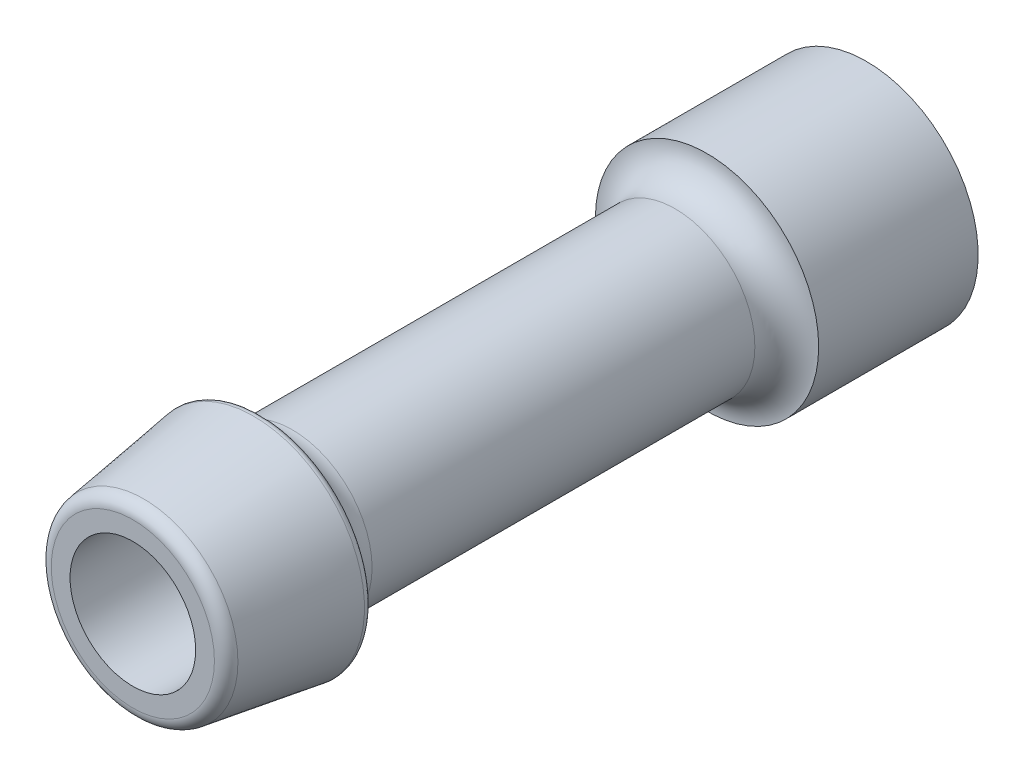
ISO-10303-21;
HEADER;
FILE_DESCRIPTION(('STEP AP214'),'2;1');
FILE_NAME('part.step','',(''),(''),'','','');
FILE_SCHEMA(('AUTOMOTIVE_DESIGN { 1 0 10303 214 1 1 1 1 }'));
ENDSEC;
DATA;
#1=APPLICATION_CONTEXT('core data for automotive mechanical design processes');
#2=APPLICATION_PROTOCOL_DEFINITION('international standard','automotive_design',2000,#1);
#3=PRODUCT_CONTEXT('',#1,'mechanical');
#4=PRODUCT('Part','Part','',(#3));
#5=PRODUCT_RELATED_PRODUCT_CATEGORY('part','',(#4));
#6=PRODUCT_DEFINITION_FORMATION('','',#4);
#7=PRODUCT_DEFINITION_CONTEXT('part definition',#1,'design');
#8=PRODUCT_DEFINITION('design','',#6,#7);
#9=PRODUCT_DEFINITION_SHAPE('','',#8);
#10=(LENGTH_UNIT() NAMED_UNIT(*) SI_UNIT(.MILLI.,.METRE.));
#11=(NAMED_UNIT(*) PLANE_ANGLE_UNIT() SI_UNIT($,.RADIAN.));
#12=(NAMED_UNIT(*) SI_UNIT($,.STERADIAN.) SOLID_ANGLE_UNIT());
#13=UNCERTAINTY_MEASURE_WITH_UNIT(LENGTH_MEASURE(1.E-05),#10,'distance_accuracy_value','');
#14=(GEOMETRIC_REPRESENTATION_CONTEXT(3) GLOBAL_UNCERTAINTY_ASSIGNED_CONTEXT((#13)) GLOBAL_UNIT_ASSIGNED_CONTEXT((#10,
#11,#12)) REPRESENTATION_CONTEXT('',''));
#15=CARTESIAN_POINT('',(0.,0.,0.));
#16=DIRECTION('',(0.,0.,1.));
#17=DIRECTION('',(1.,0.,0.));
#18=AXIS2_PLACEMENT_3D('',#15,#16,#17);
#19=CARTESIAN_POINT('',(0.,0.,29.21));
#20=DIRECTION('',(0.,0.,-1.));
#21=DIRECTION('',(-1.,0.,0.));
#22=AXIS2_PLACEMENT_3D('',#19,#20,#21);
#23=CYLINDRICAL_SURFACE('',#22,4.445);
#24=CARTESIAN_POINT('',(0.,0.,0.));
#25=DIRECTION('',(0.,0.,1.));
#26=DIRECTION('',(1.,0.,0.));
#27=AXIS2_PLACEMENT_3D('',#24,#25,#26);
#28=CIRCLE('',#27,4.445);
#29=CARTESIAN_POINT('',(-4.445,0.,0.));
#30=VERTEX_POINT('',#29);
#31=EDGE_CURVE('E71',#30,#30,#28,.T.);
#32=CARTESIAN_POINT('',(0.,0.,6.35));
#33=DIRECTION('',(0.,0.,1.));
#34=DIRECTION('',(1.,0.,0.));
#35=AXIS2_PLACEMENT_3D('',#32,#33,#34);
#36=CIRCLE('',#35,4.445);
#37=CARTESIAN_POINT('',(-4.445,0.,6.34999999999999));
#38=VERTEX_POINT('',#37);
#39=EDGE_CURVE('E72',#38,#38,#36,.T.);
#40=CARTESIAN_POINT('',(-4.445,0.,0.));
#41=CARTESIAN_POINT('',(-4.445,0.,0.066145833333333));
#42=CARTESIAN_POINT('',(-4.445,0.,0.132291666666666));
#43=CARTESIAN_POINT('',(-4.445,0.,0.264583333333332));
#44=CARTESIAN_POINT('',(-4.445,0.,0.330729166666665));
#45=CARTESIAN_POINT('',(-4.445,0.,0.463020833333332));
#46=CARTESIAN_POINT('',(-4.445,0.,0.529166666666666));
#47=CARTESIAN_POINT('',(-4.445,0.,0.661458333333333));
#48=CARTESIAN_POINT('',(-4.445,0.,0.727604166666666));
#49=CARTESIAN_POINT('',(-4.445,0.,0.859895833333332));
#50=CARTESIAN_POINT('',(-4.445,0.,0.926041666666665));
#51=CARTESIAN_POINT('',(-4.445,0.,1.05833333333333));
#52=CARTESIAN_POINT('',(-4.445,0.,1.12447916666667));
#53=CARTESIAN_POINT('',(-4.445,0.,1.25677083333333));
#54=CARTESIAN_POINT('',(-4.445,0.,1.32291666666667));
#55=CARTESIAN_POINT('',(-4.445,0.,1.45520833333333));
#56=CARTESIAN_POINT('',(-4.445,0.,1.52135416666667));
#57=CARTESIAN_POINT('',(-4.445,0.,1.65364583333333));
#58=CARTESIAN_POINT('',(-4.445,0.,1.71979166666666));
#59=CARTESIAN_POINT('',(-4.445,0.,1.85208333333333));
#60=CARTESIAN_POINT('',(-4.445,0.,1.91822916666666));
#61=CARTESIAN_POINT('',(-4.445,0.,2.05052083333333));
#62=CARTESIAN_POINT('',(-4.445,0.,2.11666666666666));
#63=CARTESIAN_POINT('',(-4.445,0.,2.24895833333333));
#64=CARTESIAN_POINT('',(-4.445,0.,2.31510416666667));
#65=CARTESIAN_POINT('',(-4.445,0.,2.44739583333333));
#66=CARTESIAN_POINT('',(-4.445,0.,2.51354166666666));
#67=CARTESIAN_POINT('',(-4.445,0.,2.64583333333333));
#68=CARTESIAN_POINT('',(-4.445,0.,2.71197916666667));
#69=CARTESIAN_POINT('',(-4.445,0.,2.84427083333333));
#70=CARTESIAN_POINT('',(-4.445,0.,2.91041666666667));
#71=CARTESIAN_POINT('',(-4.445,0.,3.04270833333333));
#72=CARTESIAN_POINT('',(-4.445,0.,3.10885416666666));
#73=CARTESIAN_POINT('',(-4.445,0.,3.24114583333333));
#74=CARTESIAN_POINT('',(-4.445,0.,3.30729166666666));
#75=CARTESIAN_POINT('',(-4.445,0.,3.43958333333333));
#76=CARTESIAN_POINT('',(-4.445,0.,3.50572916666666));
#77=CARTESIAN_POINT('',(-4.445,0.,3.63802083333333));
#78=CARTESIAN_POINT('',(-4.445,0.,3.70416666666666));
#79=CARTESIAN_POINT('',(-4.445,0.,3.83645833333333));
#80=CARTESIAN_POINT('',(-4.445,0.,3.90260416666666));
#81=CARTESIAN_POINT('',(-4.445,0.,4.03489583333333));
#82=CARTESIAN_POINT('',(-4.445,0.,4.10104166666666));
#83=CARTESIAN_POINT('',(-4.445,0.,4.23333333333333));
#84=CARTESIAN_POINT('',(-4.445,0.,4.29947916666666));
#85=CARTESIAN_POINT('',(-4.445,0.,4.43177083333333));
#86=CARTESIAN_POINT('',(-4.445,0.,4.49791666666666));
#87=CARTESIAN_POINT('',(-4.445,0.,4.63020833333333));
#88=CARTESIAN_POINT('',(-4.445,0.,4.69635416666666));
#89=CARTESIAN_POINT('',(-4.445,0.,4.82864583333333));
#90=CARTESIAN_POINT('',(-4.445,0.,4.89479166666666));
#91=CARTESIAN_POINT('',(-4.445,0.,5.02708333333333));
#92=CARTESIAN_POINT('',(-4.445,0.,5.09322916666666));
#93=CARTESIAN_POINT('',(-4.445,0.,5.22552083333333));
#94=CARTESIAN_POINT('',(-4.445,0.,5.29166666666666));
#95=CARTESIAN_POINT('',(-4.445,0.,5.42395833333333));
#96=CARTESIAN_POINT('',(-4.445,0.,5.49010416666666));
#97=CARTESIAN_POINT('',(-4.445,0.,5.62239583333333));
#98=CARTESIAN_POINT('',(-4.445,0.,5.68854166666666));
#99=CARTESIAN_POINT('',(-4.445,0.,5.82083333333333));
#100=CARTESIAN_POINT('',(-4.445,0.,5.88697916666666));
#101=CARTESIAN_POINT('',(-4.445,0.,6.01927083333333));
#102=CARTESIAN_POINT('',(-4.445,0.,6.08541666666666));
#103=CARTESIAN_POINT('',(-4.445,0.,6.21770833333333));
#104=CARTESIAN_POINT('',(-4.445,0.,6.28385416666666));
#105=CARTESIAN_POINT('',(-4.445,0.,6.34999999999999));
#106=B_SPLINE_CURVE_WITH_KNOTS('',3,(#40,#41,#42,#43,#44,#45,#46,#47,#48,#49,#50,#51,#52,#53,
#54,#55,#56,#57,#58,#59,#60,#61,#62,#63,#64,#65,#66,#67,#68,#69,#70,#71,#72,#73,#74,#75,#76,#77,
#78,#79,#80,#81,#82,#83,#84,#85,#86,#87,#88,#89,#90,#91,#92,#93,#94,#95,#96,#97,#98,#99,#100,
#101,#102,#103,#104,#105),.UNSPECIFIED.,.F.,.F.,(4,2,2,2,2,2,2,2,2,2,2,2,2,2,2,2,2,2,2,2,2,2,2,
2,2,2,2,2,2,2,2,2,4),(0.,0.198437499999999,0.396874999999998,0.5953125,0.793749999999999,
0.992187499999998,1.190625,1.3890625,1.5875,1.7859375,1.984375,2.1828125,2.38125,2.5796875,
2.778125,2.9765625,3.175,3.3734375,3.571875,3.7703125,3.96875,4.1671875,4.365625,4.5640625,
4.7625,4.96093749999999,5.15937499999999,5.3578125,5.55625,5.75468749999999,5.953125,6.1515625,
6.34999999999999),.UNSPECIFIED.);
#107=EDGE_CURVE('BSEAM39',#30,#38,#106,.T.);
#108=ORIENTED_EDGE('',*,*,#31,.T.);
#109=ORIENTED_EDGE('',*,*,#39,.F.);
#110=ORIENTED_EDGE('',*,*,#107,.T.);
#111=ORIENTED_EDGE('',*,*,#107,.F.);
#112=EDGE_LOOP('',(#108,#110,#109,#111));
#113=FACE_BOUND('',#112,.T.);
#114=ADVANCED_FACE('F39',(#113),#23,.T.);
#115=CARTESIAN_POINT('',(0.,0.,29.21));
#116=DIRECTION('',(0.,0.,1.));
#117=DIRECTION('',(1.,0.,0.));
#118=AXIS2_PLACEMENT_3D('',#115,#116,#117);
#119=PLANE('',#118);
#120=CARTESIAN_POINT('',(0.,0.,29.21));
#121=DIRECTION('',(0.,0.,1.));
#122=DIRECTION('',(1.,0.,0.));
#123=AXIS2_PLACEMENT_3D('',#120,#121,#122);
#124=CIRCLE('',#123,3.24806810887687);
#125=CARTESIAN_POINT('',(3.24806810887687,0.,29.21));
#126=VERTEX_POINT('',#125);
#127=EDGE_CURVE('E47',#126,#126,#124,.T.);
#128=ORIENTED_EDGE('',*,*,#127,.T.);
#129=EDGE_LOOP('',(#128));
#130=FACE_BOUND('',#129,.T.);
#131=CARTESIAN_POINT('',(0.,0.,29.21));
#132=DIRECTION('',(0.,0.,1.));
#133=DIRECTION('',(1.,0.,0.));
#134=AXIS2_PLACEMENT_3D('',#131,#132,#133);
#135=CIRCLE('',#134,2.5);
#136=CARTESIAN_POINT('',(2.5,0.,29.21));
#137=VERTEX_POINT('',#136);
#138=EDGE_CURVE('E76',#137,#137,#135,.T.);
#139=ORIENTED_EDGE('',*,*,#138,.F.);
#140=EDGE_LOOP('',(#139));
#141=FACE_BOUND('',#140,.T.);
#142=ADVANCED_FACE('F90',(#130,#141),#119,.T.);
#143=CARTESIAN_POINT('',(0.,0.,0.));
#144=DIRECTION('',(0.,0.,1.));
#145=DIRECTION('',(1.,0.,0.));
#146=AXIS2_PLACEMENT_3D('',#143,#144,#145);
#147=PLANE('',#146);
#148=CARTESIAN_POINT('',(0.,0.,0.));
#149=DIRECTION('',(0.,0.,1.));
#150=DIRECTION('',(1.,0.,0.));
#151=AXIS2_PLACEMENT_3D('',#148,#149,#150);
#152=CIRCLE('',#151,2.5);
#153=CARTESIAN_POINT('',(2.5,0.,0.));
#154=VERTEX_POINT('',#153);
#155=EDGE_CURVE('E80',#154,#154,#152,.T.);
#156=ORIENTED_EDGE('',*,*,#155,.T.);
#157=EDGE_LOOP('',(#156));
#158=FACE_BOUND('',#157,.T.);
#159=ORIENTED_EDGE('',*,*,#31,.F.);
#160=EDGE_LOOP('',(#159));
#161=FACE_BOUND('',#160,.T.);
#162=ADVANCED_FACE('F92',(#158,#161),#147,.F.);
#163=CARTESIAN_POINT('',(0.,0.,30.21));
#164=DIRECTION('',(0.,0.,-1.));
#165=DIRECTION('',(-1.,0.,0.));
#166=AXIS2_PLACEMENT_3D('',#163,#164,#165);
#167=CYLINDRICAL_SURFACE('',#166,2.5);
#168=ORIENTED_EDGE('',*,*,#155,.F.);
#169=EDGE_LOOP('',(#168));
#170=FACE_BOUND('',#169,.T.);
#171=ORIENTED_EDGE('',*,*,#138,.T.);
#172=EDGE_LOOP('',(#171));
#173=FACE_BOUND('',#172,.T.);
#174=ADVANCED_FACE('F88',(#170,#173),#167,.F.);
#175=CARTESIAN_POINT('',(0.,0.,6.35));
#176=DIRECTION('',(0.,0.,1.));
#177=DIRECTION('',(1.,0.,0.));
#178=AXIS2_PLACEMENT_3D('',#175,#176,#177);
#179=CYLINDRICAL_SURFACE('',#178,3.175);
#180=CARTESIAN_POINT('',(0.,0.,22.86));
#181=DIRECTION('',(0.,0.,1.));
#182=DIRECTION('',(1.,0.,0.));
#183=AXIS2_PLACEMENT_3D('',#180,#181,#182);
#184=CIRCLE('',#183,3.175);
#185=CARTESIAN_POINT('',(3.175,0.,22.86));
#186=VERTEX_POINT('',#185);
#187=EDGE_CURVE('E63',#186,#186,#184,.F.);
#188=ORIENTED_EDGE('',*,*,#187,.T.);
#189=EDGE_LOOP('',(#188));
#190=FACE_BOUND('',#189,.T.);
#191=CARTESIAN_POINT('',(0.,0.,7.62));
#192=DIRECTION('',(0.,0.,1.));
#193=DIRECTION('',(1.,0.,0.));
#194=AXIS2_PLACEMENT_3D('',#191,#192,#193);
#195=CIRCLE('',#194,3.175);
#196=CARTESIAN_POINT('',(3.175,0.,7.62));
#197=VERTEX_POINT('',#196);
#198=EDGE_CURVE('E67',#197,#197,#195,.T.);
#199=ORIENTED_EDGE('',*,*,#198,.T.);
#200=EDGE_LOOP('',(#199));
#201=FACE_BOUND('',#200,.T.);
#202=ADVANCED_FACE('F109',(#190,#201),#179,.T.);
#203=CARTESIAN_POINT('',(0.,0.,7.62));
#204=DIRECTION('',(0.,0.,1.));
#205=DIRECTION('',(1.,0.,0.));
#206=AXIS2_PLACEMENT_3D('',#203,#204,#205);
#207=TOROIDAL_SURFACE('',#206,4.445,1.27);
#208=ORIENTED_EDGE('',*,*,#39,.T.);
#209=EDGE_LOOP('',(#208));
#210=FACE_BOUND('',#209,.T.);
#211=ORIENTED_EDGE('',*,*,#198,.F.);
#212=EDGE_LOOP('',(#211));
#213=FACE_BOUND('',#212,.T.);
#214=ADVANCED_FACE('F105',(#210,#213),#207,.F.);
#215=CARTESIAN_POINT('',(0.,0.,22.86));
#216=DIRECTION('',(0.,0.,1.));
#217=DIRECTION('',(1.,0.,0.));
#218=AXIS2_PLACEMENT_3D('',#215,#216,#217);
#219=TOROIDAL_SURFACE('',#218,4.445,1.27);
#220=CARTESIAN_POINT('',(0.,0.,24.1066973734676));
#221=DIRECTION('',(0.,0.,-1.));
#222=DIRECTION('',(-1.,0.,0.));
#223=AXIS2_PLACEMENT_3D('',#220,#221,#222);
#224=CIRCLE('',#223,4.20283134185255);
#225=CARTESIAN_POINT('',(-4.20283134185255,0.,24.1066973734676));
#226=VERTEX_POINT('',#225);
#227=EDGE_CURVE('E52',#226,#226,#224,.T.);
#228=ORIENTED_EDGE('',*,*,#227,.T.);
#229=EDGE_LOOP('',(#228));
#230=FACE_BOUND('',#229,.T.);
#231=ORIENTED_EDGE('',*,*,#187,.F.);
#232=EDGE_LOOP('',(#231));
#233=FACE_BOUND('',#232,.T.);
#234=ADVANCED_FACE('F108',(#230,#233),#219,.F.);
#235=CARTESIAN_POINT('',(0.,0.,29.21));
#236=DIRECTION('',(0.,0.,-1.));
#237=DIRECTION('',(-1.,0.,0.));
#238=AXIS2_PLACEMENT_3D('',#235,#236,#237);
#239=CONICAL_SURFACE('',#238,3.68578891314646,0.148352986419515);
#240=CARTESIAN_POINT('',(0.,0.,28.7770871808538));
#241=DIRECTION('',(0.,0.,1.));
#242=DIRECTION('',(1.,0.,0.));
#243=AXIS2_PLACEMENT_3D('',#240,#241,#242);
#244=CIRCLE('',#243,3.75048816746473);
#245=CARTESIAN_POINT('',(3.75048816746473,0.,28.7770871808538));
#246=VERTEX_POINT('',#245);
#247=EDGE_CURVE('E10',#246,#246,#244,.F.);
#248=ORIENTED_EDGE('',*,*,#247,.T.);
#249=EDGE_LOOP('',(#248));
#250=FACE_BOUND('',#249,.T.);
#251=CARTESIAN_POINT('',(0.,0.,24.3935804385881));
#252=DIRECTION('',(0.,0.,-1.));
#253=DIRECTION('',(-1.,0.,0.));
#254=AXIS2_PLACEMENT_3D('',#251,#252,#253);
#255=CIRCLE('',#254,4.40560763951698);
#256=CARTESIAN_POINT('',(-4.40560763951698,0.,24.3935804385881));
#257=VERTEX_POINT('',#256);
#258=EDGE_CURVE('E57',#257,#257,#255,.F.);
#259=ORIENTED_EDGE('',*,*,#258,.T.);
#260=EDGE_LOOP('',(#259));
#261=FACE_BOUND('',#260,.T.);
#262=ADVANCED_FACE('F113',(#250,#261),#239,.T.);
#263=CARTESIAN_POINT('',(0.,0.,24.3560368481611));
#264=DIRECTION('',(0.,0.,-1.));
#265=DIRECTION('',(-1.,0.,0.));
#266=AXIS2_PLACEMENT_3D('',#263,#264,#265);
#267=TOROIDAL_SURFACE('',#266,4.15439761022306,0.254);
#268=ORIENTED_EDGE('',*,*,#227,.F.);
#269=EDGE_LOOP('',(#268));
#270=FACE_BOUND('',#269,.T.);
#271=ORIENTED_EDGE('',*,*,#258,.F.);
#272=EDGE_LOOP('',(#271));
#273=FACE_BOUND('',#272,.T.);
#274=ADVANCED_FACE('F119',(#270,#273),#267,.T.);
#275=CARTESIAN_POINT('',(0.,0.,28.702));
#276=DIRECTION('',(0.,0.,1.));
#277=DIRECTION('',(1.,0.,0.));
#278=AXIS2_PLACEMENT_3D('',#275,#276,#277);
#279=TOROIDAL_SURFACE('',#278,3.24806810887687,0.508);
#280=ORIENTED_EDGE('',*,*,#247,.F.);
#281=EDGE_LOOP('',(#280));
#282=FACE_BOUND('',#281,.T.);
#283=ORIENTED_EDGE('',*,*,#127,.F.);
#284=EDGE_LOOP('',(#283));
#285=FACE_BOUND('',#284,.T.);
#286=ADVANCED_FACE('F41',(#282,#285),#279,.T.);
#287=CLOSED_SHELL('',(#114,#142,#162,#174,#202,#214,#234,#262,#274,#286));
#288=MANIFOLD_SOLID_BREP('B2',#287);
#289=ADVANCED_BREP_SHAPE_REPRESENTATION('',(#18,#288),#14);
#290=SHAPE_DEFINITION_REPRESENTATION(#9,#289);
ENDSEC;
END-ISO-10303-21;
